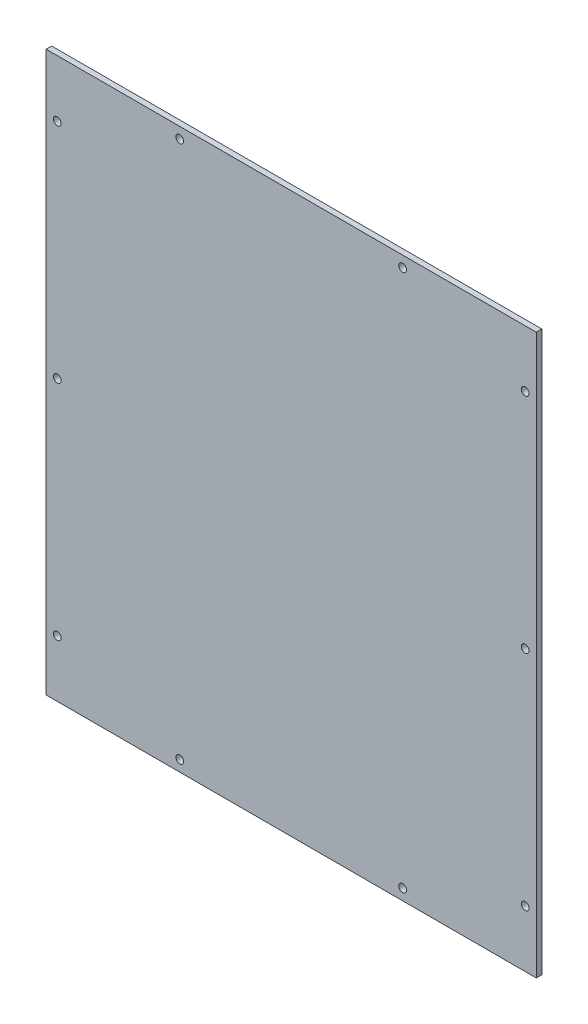
ISO-10303-21;
HEADER;
FILE_DESCRIPTION(('STEP AP214'),'2;1');
FILE_NAME('part.step','',(''),(''),'','','');
FILE_SCHEMA(('AUTOMOTIVE_DESIGN { 1 0 10303 214 1 1 1 1 }'));
ENDSEC;
DATA;
#1=APPLICATION_CONTEXT('core data for automotive mechanical design processes');
#2=APPLICATION_PROTOCOL_DEFINITION('international standard','automotive_design',2000,#1);
#3=PRODUCT_CONTEXT('',#1,'mechanical');
#4=PRODUCT('Part','Part','',(#3));
#5=PRODUCT_RELATED_PRODUCT_CATEGORY('part','',(#4));
#6=PRODUCT_DEFINITION_FORMATION('','',#4);
#7=PRODUCT_DEFINITION_CONTEXT('part definition',#1,'design');
#8=PRODUCT_DEFINITION('design','',#6,#7);
#9=PRODUCT_DEFINITION_SHAPE('','',#8);
#10=(LENGTH_UNIT() NAMED_UNIT(*) SI_UNIT(.MILLI.,.METRE.));
#11=(NAMED_UNIT(*) PLANE_ANGLE_UNIT() SI_UNIT($,.RADIAN.));
#12=(NAMED_UNIT(*) SI_UNIT($,.STERADIAN.) SOLID_ANGLE_UNIT());
#13=UNCERTAINTY_MEASURE_WITH_UNIT(LENGTH_MEASURE(1.E-05),#10,'distance_accuracy_value','');
#14=(GEOMETRIC_REPRESENTATION_CONTEXT(3) GLOBAL_UNCERTAINTY_ASSIGNED_CONTEXT((#13)) GLOBAL_UNIT_ASSIGNED_CONTEXT((#10,
#11,#12)) REPRESENTATION_CONTEXT('',''));
#15=CARTESIAN_POINT('',(0.,0.,0.));
#16=DIRECTION('',(0.,0.,1.));
#17=DIRECTION('',(1.,0.,0.));
#18=AXIS2_PLACEMENT_3D('',#15,#16,#17);
#19=CARTESIAN_POINT('',(0.,0.,-2.5));
#20=DIRECTION('',(0.,0.,-1.));
#21=DIRECTION('',(-1.,0.,0.));
#22=AXIS2_PLACEMENT_3D('',#19,#20,#21);
#23=PLANE('',#22);
#24=CARTESIAN_POINT('',(210.,-200.,-2.5));
#25=DIRECTION('',(0.,0.,-1.));
#26=DIRECTION('',(-1.,0.,0.));
#27=AXIS2_PLACEMENT_3D('',#24,#25,#26);
#28=CIRCLE('',#27,3.49999999999999);
#29=CARTESIAN_POINT('',(206.5,-200.,-2.5));
#30=VERTEX_POINT('',#29);
#31=EDGE_CURVE('E180',#30,#30,#28,.T.);
#32=ORIENTED_EDGE('',*,*,#31,.F.);
#33=EDGE_LOOP('',(#32));
#34=FACE_BOUND('',#33,.T.);
#35=CARTESIAN_POINT('',(210.,200.,-2.5));
#36=DIRECTION('',(0.,0.,-1.));
#37=DIRECTION('',(1.,0.,0.));
#38=AXIS2_PLACEMENT_3D('',#35,#36,#37);
#39=CIRCLE('',#38,3.49999999999999);
#40=CARTESIAN_POINT('',(213.5,200.,-2.5));
#41=VERTEX_POINT('',#40);
#42=EDGE_CURVE('E184',#41,#41,#39,.T.);
#43=ORIENTED_EDGE('',*,*,#42,.F.);
#44=EDGE_LOOP('',(#43));
#45=FACE_BOUND('',#44,.T.);
#46=CARTESIAN_POINT('',(210.,0.,-2.5));
#47=DIRECTION('',(0.,0.,-1.));
#48=DIRECTION('',(1.,0.,0.));
#49=AXIS2_PLACEMENT_3D('',#46,#47,#48);
#50=CIRCLE('',#49,3.49999999999999);
#51=CARTESIAN_POINT('',(213.5,0.,-2.5));
#52=VERTEX_POINT('',#51);
#53=EDGE_CURVE('E188',#52,#52,#50,.T.);
#54=ORIENTED_EDGE('',*,*,#53,.F.);
#55=EDGE_LOOP('',(#54));
#56=FACE_BOUND('',#55,.T.);
#57=CARTESIAN_POINT('',(99.9999999999999,-241.125,-2.5));
#58=DIRECTION('',(0.,0.,-1.));
#59=DIRECTION('',(-1.,0.,0.));
#60=AXIS2_PLACEMENT_3D('',#57,#58,#59);
#61=CIRCLE('',#60,3.50000000000001);
#62=CARTESIAN_POINT('',(96.4999999999999,-241.125,-2.5));
#63=VERTEX_POINT('',#62);
#64=EDGE_CURVE('E192',#63,#63,#61,.T.);
#65=ORIENTED_EDGE('',*,*,#64,.F.);
#66=EDGE_LOOP('',(#65));
#67=FACE_BOUND('',#66,.T.);
#68=CARTESIAN_POINT('',(-210.,200.,-2.5));
#69=DIRECTION('',(0.,0.,-1.));
#70=DIRECTION('',(-1.,0.,0.));
#71=AXIS2_PLACEMENT_3D('',#68,#69,#70);
#72=CIRCLE('',#71,3.49999999999999);
#73=CARTESIAN_POINT('',(-213.5,200.,-2.5));
#74=VERTEX_POINT('',#73);
#75=EDGE_CURVE('E196',#74,#74,#72,.T.);
#76=ORIENTED_EDGE('',*,*,#75,.F.);
#77=EDGE_LOOP('',(#76));
#78=FACE_BOUND('',#77,.T.);
#79=CARTESIAN_POINT('',(-100.,241.125,-2.5));
#80=DIRECTION('',(0.,0.,-1.));
#81=DIRECTION('',(-1.,0.,0.));
#82=AXIS2_PLACEMENT_3D('',#79,#80,#81);
#83=CIRCLE('',#82,3.50000000000001);
#84=CARTESIAN_POINT('',(-103.5,241.125,-2.5));
#85=VERTEX_POINT('',#84);
#86=EDGE_CURVE('E200',#85,#85,#83,.T.);
#87=ORIENTED_EDGE('',*,*,#86,.F.);
#88=EDGE_LOOP('',(#87));
#89=FACE_BOUND('',#88,.T.);
#90=CARTESIAN_POINT('',(100.,241.125,-2.5));
#91=DIRECTION('',(0.,0.,-1.));
#92=DIRECTION('',(1.,0.,0.));
#93=AXIS2_PLACEMENT_3D('',#90,#91,#92);
#94=CIRCLE('',#93,3.50000000000001);
#95=CARTESIAN_POINT('',(103.5,241.125,-2.5));
#96=VERTEX_POINT('',#95);
#97=EDGE_CURVE('E204',#96,#96,#94,.T.);
#98=ORIENTED_EDGE('',*,*,#97,.F.);
#99=EDGE_LOOP('',(#98));
#100=FACE_BOUND('',#99,.T.);
#101=CARTESIAN_POINT('',(-210.,-200.,-2.5));
#102=DIRECTION('',(0.,0.,-1.));
#103=DIRECTION('',(1.,0.,0.));
#104=AXIS2_PLACEMENT_3D('',#101,#102,#103);
#105=CIRCLE('',#104,3.49999999999999);
#106=CARTESIAN_POINT('',(-206.5,-200.,-2.5));
#107=VERTEX_POINT('',#106);
#108=EDGE_CURVE('E208',#107,#107,#105,.T.);
#109=ORIENTED_EDGE('',*,*,#108,.F.);
#110=EDGE_LOOP('',(#109));
#111=FACE_BOUND('',#110,.T.);
#112=CARTESIAN_POINT('',(-100.,-241.125,-2.5));
#113=DIRECTION('',(0.,0.,-1.));
#114=DIRECTION('',(1.,0.,0.));
#115=AXIS2_PLACEMENT_3D('',#112,#113,#114);
#116=CIRCLE('',#115,3.50000000000001);
#117=CARTESIAN_POINT('',(-96.5000000000001,-241.125,-2.5));
#118=VERTEX_POINT('',#117);
#119=EDGE_CURVE('E212',#118,#118,#116,.T.);
#120=ORIENTED_EDGE('',*,*,#119,.F.);
#121=EDGE_LOOP('',(#120));
#122=FACE_BOUND('',#121,.T.);
#123=CARTESIAN_POINT('',(-210.,0.,-2.5));
#124=DIRECTION('',(0.,0.,-1.));
#125=DIRECTION('',(-1.,0.,0.));
#126=AXIS2_PLACEMENT_3D('',#123,#124,#125);
#127=CIRCLE('',#126,3.49999999999999);
#128=CARTESIAN_POINT('',(-213.5,0.,-2.5));
#129=VERTEX_POINT('',#128);
#130=EDGE_CURVE('E111',#129,#129,#127,.T.);
#131=ORIENTED_EDGE('',*,*,#130,.F.);
#132=EDGE_LOOP('',(#131));
#133=FACE_BOUND('',#132,.T.);
#134=DIRECTION('',(0.,1.,0.));
#135=VECTOR('',#134,1.);
#136=CARTESIAN_POINT('',(220.,-251.,-2.5));
#137=LINE('',#136,#135);
#138=CARTESIAN_POINT('',(220.,251.,-2.5));
#139=VERTEX_POINT('',#138);
#140=CARTESIAN_POINT('',(220.,-251.,-2.5));
#141=VERTEX_POINT('',#140);
#142=EDGE_CURVE('E92',#139,#141,#137,.F.);
#143=ORIENTED_EDGE('',*,*,#142,.T.);
#144=DIRECTION('',(1.,0.,0.));
#145=VECTOR('',#144,1.);
#146=CARTESIAN_POINT('',(-220.,-251.,-2.5));
#147=LINE('',#146,#145);
#148=CARTESIAN_POINT('',(-220.,-251.,-2.5));
#149=VERTEX_POINT('',#148);
#150=EDGE_CURVE('E83',#141,#149,#147,.F.);
#151=ORIENTED_EDGE('',*,*,#150,.T.);
#152=DIRECTION('',(0.,1.,0.));
#153=VECTOR('',#152,1.);
#154=CARTESIAN_POINT('',(-220.,-251.,-2.5));
#155=LINE('',#154,#153);
#156=CARTESIAN_POINT('',(-220.,251.,-2.5));
#157=VERTEX_POINT('',#156);
#158=EDGE_CURVE('E78',#149,#157,#155,.T.);
#159=ORIENTED_EDGE('',*,*,#158,.T.);
#160=DIRECTION('',(1.,0.,0.));
#161=VECTOR('',#160,1.);
#162=CARTESIAN_POINT('',(-220.,251.,-2.5));
#163=LINE('',#162,#161);
#164=EDGE_CURVE('E95',#157,#139,#163,.T.);
#165=ORIENTED_EDGE('',*,*,#164,.T.);
#166=EDGE_LOOP('',(#143,#151,#159,#165));
#167=FACE_BOUND('',#166,.T.);
#168=ADVANCED_FACE('F42',(#34,#45,#56,#67,#78,#89,#100,#111,#122,#133,#167),#23,.T.);
#169=CARTESIAN_POINT('',(220.,-251.,2.5));
#170=DIRECTION('',(-1.,0.,0.));
#171=DIRECTION('',(0.,0.,1.));
#172=AXIS2_PLACEMENT_3D('',#169,#170,#171);
#173=PLANE('',#172);
#174=DIRECTION('',(0.,1.,0.));
#175=VECTOR('',#174,1.);
#176=CARTESIAN_POINT('',(220.,0.,2.5));
#177=LINE('',#176,#175);
#178=CARTESIAN_POINT('',(220.,251.,2.5));
#179=VERTEX_POINT('',#178);
#180=CARTESIAN_POINT('',(220.,-251.,2.5));
#181=VERTEX_POINT('',#180);
#182=EDGE_CURVE('E102',#179,#181,#177,.F.);
#183=ORIENTED_EDGE('',*,*,#182,.T.);
#184=DIRECTION('',(0.,0.,1.));
#185=VECTOR('',#184,1.);
#186=CARTESIAN_POINT('',(220.,-251.,2.5));
#187=LINE('',#186,#185);
#188=EDGE_CURVE('E88',#181,#141,#187,.F.);
#189=ORIENTED_EDGE('',*,*,#188,.T.);
#190=ORIENTED_EDGE('',*,*,#142,.F.);
#191=DIRECTION('',(0.,0.,-1.));
#192=VECTOR('',#191,1.);
#193=CARTESIAN_POINT('',(220.,251.,2.5));
#194=LINE('',#193,#192);
#195=EDGE_CURVE('E225',#139,#179,#194,.F.);
#196=ORIENTED_EDGE('',*,*,#195,.T.);
#197=EDGE_LOOP('',(#183,#189,#190,#196));
#198=FACE_BOUND('',#197,.T.);
#199=ADVANCED_FACE('F101',(#198),#173,.F.);
#200=CARTESIAN_POINT('',(-220.,-251.,2.5));
#201=DIRECTION('',(0.,1.,0.));
#202=DIRECTION('',(0.,0.,1.));
#203=AXIS2_PLACEMENT_3D('',#200,#201,#202);
#204=PLANE('',#203);
#205=DIRECTION('',(-1.,0.,0.));
#206=VECTOR('',#205,1.);
#207=CARTESIAN_POINT('',(0.,-251.,2.5));
#208=LINE('',#207,#206);
#209=CARTESIAN_POINT('',(-220.,-251.,2.5));
#210=VERTEX_POINT('',#209);
#211=EDGE_CURVE('E221',#181,#210,#208,.T.);
#212=ORIENTED_EDGE('',*,*,#211,.T.);
#213=DIRECTION('',(0.,0.,-1.));
#214=VECTOR('',#213,1.);
#215=CARTESIAN_POINT('',(-220.,-251.,2.5));
#216=LINE('',#215,#214);
#217=EDGE_CURVE('E90',#210,#149,#216,.T.);
#218=ORIENTED_EDGE('',*,*,#217,.T.);
#219=ORIENTED_EDGE('',*,*,#150,.F.);
#220=ORIENTED_EDGE('',*,*,#188,.F.);
#221=EDGE_LOOP('',(#212,#218,#219,#220));
#222=FACE_BOUND('',#221,.T.);
#223=ADVANCED_FACE('F86',(#222),#204,.F.);
#224=CARTESIAN_POINT('',(-220.,-251.,2.5));
#225=DIRECTION('',(1.,0.,0.));
#226=DIRECTION('',(0.,0.,-1.));
#227=AXIS2_PLACEMENT_3D('',#224,#225,#226);
#228=PLANE('',#227);
#229=DIRECTION('',(0.,1.,0.));
#230=VECTOR('',#229,1.);
#231=CARTESIAN_POINT('',(-220.,0.,2.5));
#232=LINE('',#231,#230);
#233=CARTESIAN_POINT('',(-220.,251.,2.5));
#234=VERTEX_POINT('',#233);
#235=EDGE_CURVE('E51',#210,#234,#232,.T.);
#236=ORIENTED_EDGE('',*,*,#235,.T.);
#237=DIRECTION('',(0.,0.,-1.));
#238=VECTOR('',#237,1.);
#239=CARTESIAN_POINT('',(-220.,251.,2.5));
#240=LINE('',#239,#238);
#241=EDGE_CURVE('E59',#234,#157,#240,.T.);
#242=ORIENTED_EDGE('',*,*,#241,.T.);
#243=ORIENTED_EDGE('',*,*,#158,.F.);
#244=ORIENTED_EDGE('',*,*,#217,.F.);
#245=EDGE_LOOP('',(#236,#242,#243,#244));
#246=FACE_BOUND('',#245,.T.);
#247=ADVANCED_FACE('F164',(#246),#228,.F.);
#248=CARTESIAN_POINT('',(-220.,251.,2.5));
#249=DIRECTION('',(0.,-1.,0.));
#250=DIRECTION('',(0.,0.,-1.));
#251=AXIS2_PLACEMENT_3D('',#248,#249,#250);
#252=PLANE('',#251);
#253=DIRECTION('',(-1.,0.,0.));
#254=VECTOR('',#253,1.);
#255=CARTESIAN_POINT('',(0.,251.,2.5));
#256=LINE('',#255,#254);
#257=EDGE_CURVE('E11',#234,#179,#256,.F.);
#258=ORIENTED_EDGE('',*,*,#257,.T.);
#259=ORIENTED_EDGE('',*,*,#195,.F.);
#260=ORIENTED_EDGE('',*,*,#164,.F.);
#261=ORIENTED_EDGE('',*,*,#241,.F.);
#262=EDGE_LOOP('',(#258,#259,#260,#261));
#263=FACE_BOUND('',#262,.T.);
#264=ADVANCED_FACE('F155',(#263),#252,.F.);
#265=CARTESIAN_POINT('',(0.,0.,2.5));
#266=DIRECTION('',(0.,0.,-1.));
#267=DIRECTION('',(-1.,0.,0.));
#268=AXIS2_PLACEMENT_3D('',#265,#266,#267);
#269=PLANE('',#268);
#270=CARTESIAN_POINT('',(210.,-200.,2.5));
#271=DIRECTION('',(0.,0.,-1.));
#272=DIRECTION('',(-1.,0.,0.));
#273=AXIS2_PLACEMENT_3D('',#270,#271,#272);
#274=CIRCLE('',#273,3.49999999999999);
#275=CARTESIAN_POINT('',(206.5,-200.,2.5));
#276=VERTEX_POINT('',#275);
#277=EDGE_CURVE('E45',#276,#276,#274,.T.);
#278=ORIENTED_EDGE('',*,*,#277,.T.);
#279=EDGE_LOOP('',(#278));
#280=FACE_BOUND('',#279,.T.);
#281=CARTESIAN_POINT('',(210.,200.,2.5));
#282=DIRECTION('',(0.,0.,-1.));
#283=DIRECTION('',(-1.,0.,0.));
#284=AXIS2_PLACEMENT_3D('',#281,#282,#283);
#285=CIRCLE('',#284,3.49999999999999);
#286=CARTESIAN_POINT('',(206.5,200.,2.5));
#287=VERTEX_POINT('',#286);
#288=EDGE_CURVE('E131',#287,#287,#285,.T.);
#289=ORIENTED_EDGE('',*,*,#288,.T.);
#290=EDGE_LOOP('',(#289));
#291=FACE_BOUND('',#290,.T.);
#292=CARTESIAN_POINT('',(210.,0.,2.5));
#293=DIRECTION('',(0.,0.,-1.));
#294=DIRECTION('',(-1.,0.,0.));
#295=AXIS2_PLACEMENT_3D('',#292,#293,#294);
#296=CIRCLE('',#295,3.49999999999999);
#297=CARTESIAN_POINT('',(206.5,0.,2.5));
#298=VERTEX_POINT('',#297);
#299=EDGE_CURVE('E129',#298,#298,#296,.T.);
#300=ORIENTED_EDGE('',*,*,#299,.T.);
#301=EDGE_LOOP('',(#300));
#302=FACE_BOUND('',#301,.T.);
#303=CARTESIAN_POINT('',(99.9999999999999,-241.125,2.5));
#304=DIRECTION('',(0.,0.,-1.));
#305=DIRECTION('',(-1.,0.,0.));
#306=AXIS2_PLACEMENT_3D('',#303,#304,#305);
#307=CIRCLE('',#306,3.50000000000001);
#308=CARTESIAN_POINT('',(96.4999999999999,-241.125,2.5));
#309=VERTEX_POINT('',#308);
#310=EDGE_CURVE('E126',#309,#309,#307,.T.);
#311=ORIENTED_EDGE('',*,*,#310,.T.);
#312=EDGE_LOOP('',(#311));
#313=FACE_BOUND('',#312,.T.);
#314=CARTESIAN_POINT('',(-210.,200.,2.5));
#315=DIRECTION('',(0.,0.,-1.));
#316=DIRECTION('',(-1.,0.,0.));
#317=AXIS2_PLACEMENT_3D('',#314,#315,#316);
#318=CIRCLE('',#317,3.49999999999999);
#319=CARTESIAN_POINT('',(-213.5,200.,2.5));
#320=VERTEX_POINT('',#319);
#321=EDGE_CURVE('E123',#320,#320,#318,.T.);
#322=ORIENTED_EDGE('',*,*,#321,.T.);
#323=EDGE_LOOP('',(#322));
#324=FACE_BOUND('',#323,.T.);
#325=CARTESIAN_POINT('',(-100.,241.125,2.5));
#326=DIRECTION('',(0.,0.,-1.));
#327=DIRECTION('',(-1.,0.,0.));
#328=AXIS2_PLACEMENT_3D('',#325,#326,#327);
#329=CIRCLE('',#328,3.50000000000001);
#330=CARTESIAN_POINT('',(-103.5,241.125,2.5));
#331=VERTEX_POINT('',#330);
#332=EDGE_CURVE('E120',#331,#331,#329,.T.);
#333=ORIENTED_EDGE('',*,*,#332,.T.);
#334=EDGE_LOOP('',(#333));
#335=FACE_BOUND('',#334,.T.);
#336=CARTESIAN_POINT('',(100.,241.125,2.5));
#337=DIRECTION('',(0.,0.,-1.));
#338=DIRECTION('',(-1.,0.,0.));
#339=AXIS2_PLACEMENT_3D('',#336,#337,#338);
#340=CIRCLE('',#339,3.50000000000001);
#341=CARTESIAN_POINT('',(96.5,241.125,2.5));
#342=VERTEX_POINT('',#341);
#343=EDGE_CURVE('E117',#342,#342,#340,.T.);
#344=ORIENTED_EDGE('',*,*,#343,.T.);
#345=EDGE_LOOP('',(#344));
#346=FACE_BOUND('',#345,.T.);
#347=CARTESIAN_POINT('',(-210.,-200.,2.5));
#348=DIRECTION('',(0.,0.,-1.));
#349=DIRECTION('',(-1.,0.,0.));
#350=AXIS2_PLACEMENT_3D('',#347,#348,#349);
#351=CIRCLE('',#350,3.49999999999999);
#352=CARTESIAN_POINT('',(-213.5,-200.,2.5));
#353=VERTEX_POINT('',#352);
#354=EDGE_CURVE('E114',#353,#353,#351,.T.);
#355=ORIENTED_EDGE('',*,*,#354,.T.);
#356=EDGE_LOOP('',(#355));
#357=FACE_BOUND('',#356,.T.);
#358=CARTESIAN_POINT('',(-100.,-241.125,2.5));
#359=DIRECTION('',(0.,0.,-1.));
#360=DIRECTION('',(-1.,0.,0.));
#361=AXIS2_PLACEMENT_3D('',#358,#359,#360);
#362=CIRCLE('',#361,3.50000000000001);
#363=CARTESIAN_POINT('',(-103.5,-241.125,2.5));
#364=VERTEX_POINT('',#363);
#365=EDGE_CURVE('E110',#364,#364,#362,.T.);
#366=ORIENTED_EDGE('',*,*,#365,.T.);
#367=EDGE_LOOP('',(#366));
#368=FACE_BOUND('',#367,.T.);
#369=CARTESIAN_POINT('',(-210.,0.,2.5));
#370=DIRECTION('',(0.,0.,-1.));
#371=DIRECTION('',(-1.,0.,0.));
#372=AXIS2_PLACEMENT_3D('',#369,#370,#371);
#373=CIRCLE('',#372,3.49999999999999);
#374=CARTESIAN_POINT('',(-213.5,0.,2.5));
#375=VERTEX_POINT('',#374);
#376=EDGE_CURVE('E107',#375,#375,#373,.T.);
#377=ORIENTED_EDGE('',*,*,#376,.T.);
#378=EDGE_LOOP('',(#377));
#379=FACE_BOUND('',#378,.T.);
#380=ORIENTED_EDGE('',*,*,#235,.F.);
#381=ORIENTED_EDGE('',*,*,#211,.F.);
#382=ORIENTED_EDGE('',*,*,#182,.F.);
#383=ORIENTED_EDGE('',*,*,#257,.F.);
#384=EDGE_LOOP('',(#380,#381,#382,#383));
#385=FACE_BOUND('',#384,.T.);
#386=ADVANCED_FACE('F138',(#280,#291,#302,#313,#324,#335,#346,#357,#368,#379,#385),#269,.F.);
#387=CARTESIAN_POINT('',(-210.,0.,7.5));
#388=DIRECTION('',(0.,0.,-1.));
#389=DIRECTION('',(-1.,0.,0.));
#390=AXIS2_PLACEMENT_3D('',#387,#388,#389);
#391=CYLINDRICAL_SURFACE('',#390,3.49999999999999);
#392=ORIENTED_EDGE('',*,*,#130,.T.);
#393=EDGE_LOOP('',(#392));
#394=FACE_BOUND('',#393,.T.);
#395=ORIENTED_EDGE('',*,*,#376,.F.);
#396=EDGE_LOOP('',(#395));
#397=FACE_BOUND('',#396,.T.);
#398=ADVANCED_FACE('F154',(#394,#397),#391,.F.);
#399=CARTESIAN_POINT('',(-100.,-241.125,7.5));
#400=DIRECTION('',(0.,0.,-1.));
#401=DIRECTION('',(-1.,0.,0.));
#402=AXIS2_PLACEMENT_3D('',#399,#400,#401);
#403=CYLINDRICAL_SURFACE('',#402,3.50000000000001);
#404=ORIENTED_EDGE('',*,*,#119,.T.);
#405=EDGE_LOOP('',(#404));
#406=FACE_BOUND('',#405,.T.);
#407=ORIENTED_EDGE('',*,*,#365,.F.);
#408=EDGE_LOOP('',(#407));
#409=FACE_BOUND('',#408,.T.);
#410=ADVANCED_FACE('F161',(#406,#409),#403,.F.);
#411=CARTESIAN_POINT('',(-210.,-200.,7.5));
#412=DIRECTION('',(0.,0.,-1.));
#413=DIRECTION('',(-1.,0.,0.));
#414=AXIS2_PLACEMENT_3D('',#411,#412,#413);
#415=CYLINDRICAL_SURFACE('',#414,3.49999999999999);
#416=ORIENTED_EDGE('',*,*,#108,.T.);
#417=EDGE_LOOP('',(#416));
#418=FACE_BOUND('',#417,.T.);
#419=ORIENTED_EDGE('',*,*,#354,.F.);
#420=EDGE_LOOP('',(#419));
#421=FACE_BOUND('',#420,.T.);
#422=ADVANCED_FACE('F239',(#418,#421),#415,.F.);
#423=CARTESIAN_POINT('',(100.,241.125,7.5));
#424=DIRECTION('',(0.,0.,-1.));
#425=DIRECTION('',(-1.,0.,0.));
#426=AXIS2_PLACEMENT_3D('',#423,#424,#425);
#427=CYLINDRICAL_SURFACE('',#426,3.50000000000001);
#428=ORIENTED_EDGE('',*,*,#97,.T.);
#429=EDGE_LOOP('',(#428));
#430=FACE_BOUND('',#429,.T.);
#431=ORIENTED_EDGE('',*,*,#343,.F.);
#432=EDGE_LOOP('',(#431));
#433=FACE_BOUND('',#432,.T.);
#434=ADVANCED_FACE('F249',(#430,#433),#427,.F.);
#435=CARTESIAN_POINT('',(-100.,241.125,7.5));
#436=DIRECTION('',(0.,0.,-1.));
#437=DIRECTION('',(-1.,0.,0.));
#438=AXIS2_PLACEMENT_3D('',#435,#436,#437);
#439=CYLINDRICAL_SURFACE('',#438,3.50000000000001);
#440=ORIENTED_EDGE('',*,*,#86,.T.);
#441=EDGE_LOOP('',(#440));
#442=FACE_BOUND('',#441,.T.);
#443=ORIENTED_EDGE('',*,*,#332,.F.);
#444=EDGE_LOOP('',(#443));
#445=FACE_BOUND('',#444,.T.);
#446=ADVANCED_FACE('F262',(#442,#445),#439,.F.);
#447=CARTESIAN_POINT('',(-210.,200.,7.5));
#448=DIRECTION('',(0.,0.,-1.));
#449=DIRECTION('',(-1.,0.,0.));
#450=AXIS2_PLACEMENT_3D('',#447,#448,#449);
#451=CYLINDRICAL_SURFACE('',#450,3.49999999999999);
#452=ORIENTED_EDGE('',*,*,#75,.T.);
#453=EDGE_LOOP('',(#452));
#454=FACE_BOUND('',#453,.T.);
#455=ORIENTED_EDGE('',*,*,#321,.F.);
#456=EDGE_LOOP('',(#455));
#457=FACE_BOUND('',#456,.T.);
#458=ADVANCED_FACE('F257',(#454,#457),#451,.F.);
#459=CARTESIAN_POINT('',(99.9999999999999,-241.125,7.5));
#460=DIRECTION('',(0.,0.,-1.));
#461=DIRECTION('',(-1.,0.,0.));
#462=AXIS2_PLACEMENT_3D('',#459,#460,#461);
#463=CYLINDRICAL_SURFACE('',#462,3.50000000000001);
#464=ORIENTED_EDGE('',*,*,#64,.T.);
#465=EDGE_LOOP('',(#464));
#466=FACE_BOUND('',#465,.T.);
#467=ORIENTED_EDGE('',*,*,#310,.F.);
#468=EDGE_LOOP('',(#467));
#469=FACE_BOUND('',#468,.T.);
#470=ADVANCED_FACE('F254',(#466,#469),#463,.F.);
#471=CARTESIAN_POINT('',(210.,0.,7.5));
#472=DIRECTION('',(0.,0.,-1.));
#473=DIRECTION('',(-1.,0.,0.));
#474=AXIS2_PLACEMENT_3D('',#471,#472,#473);
#475=CYLINDRICAL_SURFACE('',#474,3.49999999999999);
#476=ORIENTED_EDGE('',*,*,#53,.T.);
#477=EDGE_LOOP('',(#476));
#478=FACE_BOUND('',#477,.T.);
#479=ORIENTED_EDGE('',*,*,#299,.F.);
#480=EDGE_LOOP('',(#479));
#481=FACE_BOUND('',#480,.T.);
#482=ADVANCED_FACE('F148',(#478,#481),#475,.F.);
#483=CARTESIAN_POINT('',(210.,200.,7.5));
#484=DIRECTION('',(0.,0.,-1.));
#485=DIRECTION('',(-1.,0.,0.));
#486=AXIS2_PLACEMENT_3D('',#483,#484,#485);
#487=CYLINDRICAL_SURFACE('',#486,3.49999999999999);
#488=ORIENTED_EDGE('',*,*,#42,.T.);
#489=EDGE_LOOP('',(#488));
#490=FACE_BOUND('',#489,.T.);
#491=ORIENTED_EDGE('',*,*,#288,.F.);
#492=EDGE_LOOP('',(#491));
#493=FACE_BOUND('',#492,.T.);
#494=ADVANCED_FACE('F142',(#490,#493),#487,.F.);
#495=CARTESIAN_POINT('',(210.,-200.,7.5));
#496=DIRECTION('',(0.,0.,-1.));
#497=DIRECTION('',(-1.,0.,0.));
#498=AXIS2_PLACEMENT_3D('',#495,#496,#497);
#499=CYLINDRICAL_SURFACE('',#498,3.49999999999999);
#500=ORIENTED_EDGE('',*,*,#31,.T.);
#501=EDGE_LOOP('',(#500));
#502=FACE_BOUND('',#501,.T.);
#503=ORIENTED_EDGE('',*,*,#277,.F.);
#504=EDGE_LOOP('',(#503));
#505=FACE_BOUND('',#504,.T.);
#506=ADVANCED_FACE('F140',(#502,#505),#499,.F.);
#507=CLOSED_SHELL('',(#168,#199,#223,#247,#264,#386,#398,#410,#422,#434,#446,#458,#470,#482,
#494,#506));
#508=MANIFOLD_SOLID_BREP('B2',#507);
#509=ADVANCED_BREP_SHAPE_REPRESENTATION('',(#18,#508),#14);
#510=SHAPE_DEFINITION_REPRESENTATION(#9,#509);
ENDSEC;
END-ISO-10303-21;
